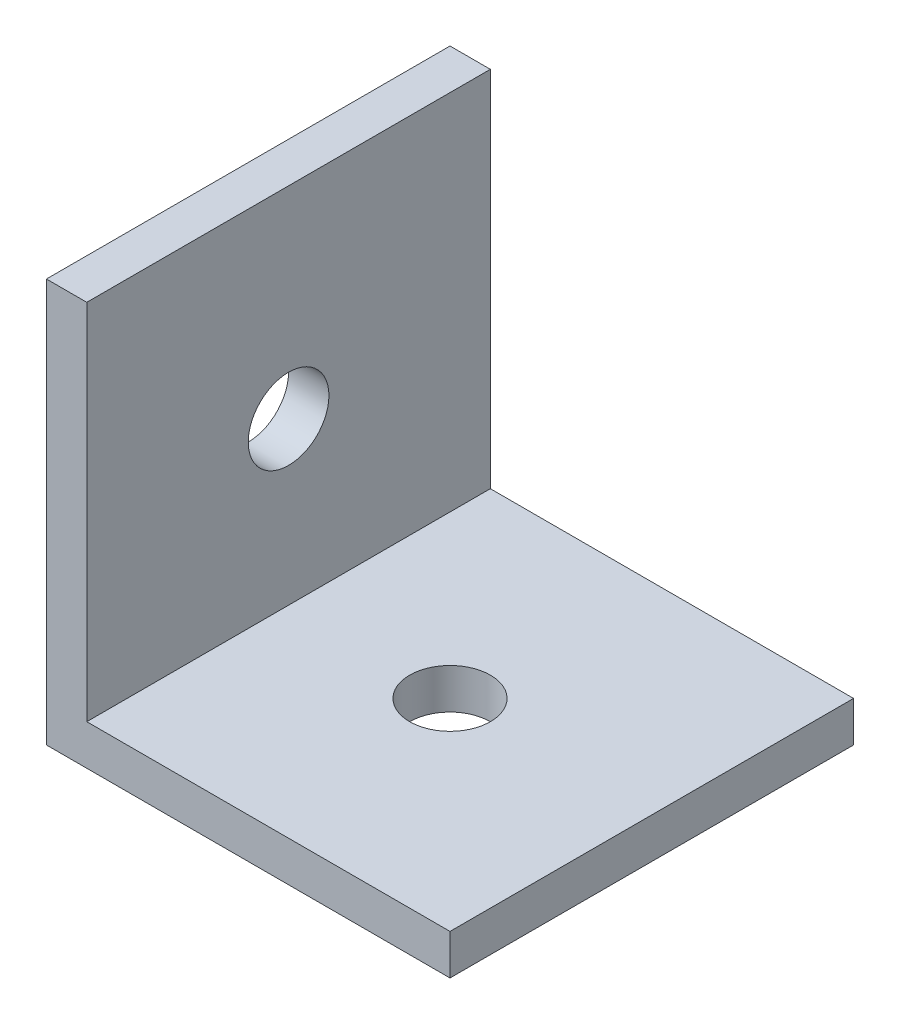
ISO-10303-21;
HEADER;
FILE_DESCRIPTION(('STEP AP214'),'2;1');
FILE_NAME('part.step','',(''),(''),'','','');
FILE_SCHEMA(('AUTOMOTIVE_DESIGN { 1 0 10303 214 1 1 1 1 }'));
ENDSEC;
DATA;
#1=APPLICATION_CONTEXT('core data for automotive mechanical design processes');
#2=APPLICATION_PROTOCOL_DEFINITION('international standard','automotive_design',2000,#1);
#3=PRODUCT_CONTEXT('',#1,'mechanical');
#4=PRODUCT('Part','Part','',(#3));
#5=PRODUCT_RELATED_PRODUCT_CATEGORY('part','',(#4));
#6=PRODUCT_DEFINITION_FORMATION('','',#4);
#7=PRODUCT_DEFINITION_CONTEXT('part definition',#1,'design');
#8=PRODUCT_DEFINITION('design','',#6,#7);
#9=PRODUCT_DEFINITION_SHAPE('','',#8);
#10=(LENGTH_UNIT() NAMED_UNIT(*) SI_UNIT(.MILLI.,.METRE.));
#11=(NAMED_UNIT(*) PLANE_ANGLE_UNIT() SI_UNIT($,.RADIAN.));
#12=(NAMED_UNIT(*) SI_UNIT($,.STERADIAN.) SOLID_ANGLE_UNIT());
#13=UNCERTAINTY_MEASURE_WITH_UNIT(LENGTH_MEASURE(1.E-05),#10,'distance_accuracy_value','');
#14=(GEOMETRIC_REPRESENTATION_CONTEXT(3) GLOBAL_UNCERTAINTY_ASSIGNED_CONTEXT((#13)) GLOBAL_UNIT_ASSIGNED_CONTEXT((#10,
#11,#12)) REPRESENTATION_CONTEXT('',''));
#15=CARTESIAN_POINT('',(0.,0.,0.));
#16=DIRECTION('',(0.,0.,1.));
#17=DIRECTION('',(1.,0.,0.));
#18=AXIS2_PLACEMENT_3D('',#15,#16,#17);
#19=CARTESIAN_POINT('',(-25.9312653272042,3.86410526315789,15.));
#20=DIRECTION('',(0.,-1.,0.));
#21=DIRECTION('',(0.,0.,-1.));
#22=AXIS2_PLACEMENT_3D('',#19,#20,#21);
#23=PLANE('',#22);
#24=DIRECTION('',(-1.,0.,0.));
#25=VECTOR('',#24,1.);
#26=CARTESIAN_POINT('',(-25.9312653272042,3.86410526315789,0.));
#27=LINE('',#26,#25);
#28=CARTESIAN_POINT('',(-25.9312653272042,3.86410526315789,0.));
#29=VERTEX_POINT('',#28);
#30=CARTESIAN_POINT('',(-27.4312653272042,3.86410526315789,0.));
#31=VERTEX_POINT('',#30);
#32=EDGE_CURVE('E115',#29,#31,#27,.T.);
#33=ORIENTED_EDGE('',*,*,#32,.T.);
#34=DIRECTION('',(0.,0.,-1.));
#35=VECTOR('',#34,1.);
#36=CARTESIAN_POINT('',(-27.4312653272042,3.86410526315789,15.));
#37=LINE('',#36,#35);
#38=CARTESIAN_POINT('',(-27.4312653272042,3.86410526315789,15.));
#39=VERTEX_POINT('',#38);
#40=EDGE_CURVE('E11',#39,#31,#37,.T.);
#41=ORIENTED_EDGE('',*,*,#40,.F.);
#42=DIRECTION('',(-1.,0.,0.));
#43=VECTOR('',#42,1.);
#44=CARTESIAN_POINT('',(-25.9312653272042,3.86410526315789,15.));
#45=LINE('',#44,#43);
#46=CARTESIAN_POINT('',(-25.9312653272042,3.86410526315789,15.));
#47=VERTEX_POINT('',#46);
#48=EDGE_CURVE('E126',#47,#39,#45,.T.);
#49=ORIENTED_EDGE('',*,*,#48,.F.);
#50=DIRECTION('',(0.,0.,-1.));
#51=VECTOR('',#50,1.);
#52=CARTESIAN_POINT('',(-25.9312653272042,3.86410526315789,15.));
#53=LINE('',#52,#51);
#54=EDGE_CURVE('E111',#47,#29,#53,.T.);
#55=ORIENTED_EDGE('',*,*,#54,.T.);
#56=EDGE_LOOP('',(#33,#41,#49,#55));
#57=FACE_BOUND('',#56,.T.);
#58=ADVANCED_FACE('F31',(#57),#23,.F.);
#59=CARTESIAN_POINT('',(-27.4312653272042,3.86410526315789,15.));
#60=DIRECTION('',(1.,0.,0.));
#61=DIRECTION('',(0.,0.,-1.));
#62=AXIS2_PLACEMENT_3D('',#59,#60,#61);
#63=PLANE('',#62);
#64=CARTESIAN_POINT('',(-27.4312653272042,-3.63589473684211,7.5));
#65=DIRECTION('',(1.,0.,0.));
#66=DIRECTION('',(0.,0.,-1.));
#67=AXIS2_PLACEMENT_3D('',#64,#65,#66);
#68=CIRCLE('',#67,1.5);
#69=CARTESIAN_POINT('',(-27.4312653272042,-3.63589473684211,6.));
#70=VERTEX_POINT('',#69);
#71=EDGE_CURVE('E119',#70,#70,#68,.T.);
#72=ORIENTED_EDGE('',*,*,#71,.T.);
#73=EDGE_LOOP('',(#72));
#74=FACE_BOUND('',#73,.T.);
#75=DIRECTION('',(0.,-1.,0.));
#76=VECTOR('',#75,1.);
#77=CARTESIAN_POINT('',(-27.4312653272042,3.86410526315789,0.));
#78=LINE('',#77,#76);
#79=CARTESIAN_POINT('',(-27.4312653272042,-11.1358947368421,0.));
#80=VERTEX_POINT('',#79);
#81=EDGE_CURVE('E118',#31,#80,#78,.T.);
#82=ORIENTED_EDGE('',*,*,#81,.T.);
#83=DIRECTION('',(0.,0.,-1.));
#84=VECTOR('',#83,1.);
#85=CARTESIAN_POINT('',(-27.4312653272042,-11.1358947368421,15.));
#86=LINE('',#85,#84);
#87=CARTESIAN_POINT('',(-27.4312653272042,-11.1358947368421,15.));
#88=VERTEX_POINT('',#87);
#89=EDGE_CURVE('E39',#88,#80,#86,.T.);
#90=ORIENTED_EDGE('',*,*,#89,.F.);
#91=DIRECTION('',(0.,-1.,0.));
#92=VECTOR('',#91,1.);
#93=CARTESIAN_POINT('',(-27.4312653272042,3.86410526315789,15.));
#94=LINE('',#93,#92);
#95=EDGE_CURVE('E84',#39,#88,#94,.T.);
#96=ORIENTED_EDGE('',*,*,#95,.F.);
#97=ORIENTED_EDGE('',*,*,#40,.T.);
#98=EDGE_LOOP('',(#82,#90,#96,#97));
#99=FACE_BOUND('',#98,.T.);
#100=ADVANCED_FACE('F153',(#74,#99),#63,.F.);
#101=CARTESIAN_POINT('',(-27.4312653272042,-11.1358947368421,15.));
#102=DIRECTION('',(0.,1.,0.));
#103=DIRECTION('',(0.,0.,1.));
#104=AXIS2_PLACEMENT_3D('',#101,#102,#103);
#105=PLANE('',#104);
#106=CARTESIAN_POINT('',(-19.9312653272042,-11.1358947368421,7.5));
#107=DIRECTION('',(0.,1.,0.));
#108=DIRECTION('',(0.,0.,1.));
#109=AXIS2_PLACEMENT_3D('',#106,#107,#108);
#110=CIRCLE('',#109,1.5);
#111=CARTESIAN_POINT('',(-19.9312653272042,-11.1358947368421,9.));
#112=VERTEX_POINT('',#111);
#113=EDGE_CURVE('E234',#112,#112,#110,.T.);
#114=ORIENTED_EDGE('',*,*,#113,.T.);
#115=EDGE_LOOP('',(#114));
#116=FACE_BOUND('',#115,.T.);
#117=DIRECTION('',(1.,0.,0.));
#118=VECTOR('',#117,1.);
#119=CARTESIAN_POINT('',(-27.4312653272042,-11.1358947368421,0.));
#120=LINE('',#119,#118);
#121=CARTESIAN_POINT('',(-12.4312653272042,-11.1358947368421,0.));
#122=VERTEX_POINT('',#121);
#123=EDGE_CURVE('E121',#80,#122,#120,.T.);
#124=ORIENTED_EDGE('',*,*,#123,.T.);
#125=DIRECTION('',(0.,0.,-1.));
#126=VECTOR('',#125,1.);
#127=CARTESIAN_POINT('',(-12.4312653272042,-11.1358947368421,15.));
#128=LINE('',#127,#126);
#129=CARTESIAN_POINT('',(-12.4312653272042,-11.1358947368421,15.));
#130=VERTEX_POINT('',#129);
#131=EDGE_CURVE('E106',#130,#122,#128,.T.);
#132=ORIENTED_EDGE('',*,*,#131,.F.);
#133=DIRECTION('',(1.,0.,0.));
#134=VECTOR('',#133,1.);
#135=CARTESIAN_POINT('',(-27.4312653272042,-11.1358947368421,15.));
#136=LINE('',#135,#134);
#137=EDGE_CURVE('E97',#88,#130,#136,.T.);
#138=ORIENTED_EDGE('',*,*,#137,.F.);
#139=ORIENTED_EDGE('',*,*,#89,.T.);
#140=EDGE_LOOP('',(#124,#132,#138,#139));
#141=FACE_BOUND('',#140,.T.);
#142=ADVANCED_FACE('F132',(#116,#141),#105,.F.);
#143=CARTESIAN_POINT('',(-12.4312653272042,-11.1358947368421,15.));
#144=DIRECTION('',(-1.,0.,0.));
#145=DIRECTION('',(0.,0.,1.));
#146=AXIS2_PLACEMENT_3D('',#143,#144,#145);
#147=PLANE('',#146);
#148=DIRECTION('',(0.,1.,0.));
#149=VECTOR('',#148,1.);
#150=CARTESIAN_POINT('',(-12.4312653272042,-11.1358947368421,0.));
#151=LINE('',#150,#149);
#152=CARTESIAN_POINT('',(-12.4312653272042,-9.63589473684211,0.));
#153=VERTEX_POINT('',#152);
#154=EDGE_CURVE('E105',#122,#153,#151,.T.);
#155=ORIENTED_EDGE('',*,*,#154,.T.);
#156=DIRECTION('',(0.,0.,-1.));
#157=VECTOR('',#156,1.);
#158=CARTESIAN_POINT('',(-12.4312653272042,-9.63589473684211,15.));
#159=LINE('',#158,#157);
#160=CARTESIAN_POINT('',(-12.4312653272042,-9.63589473684211,15.));
#161=VERTEX_POINT('',#160);
#162=EDGE_CURVE('E102',#161,#153,#159,.T.);
#163=ORIENTED_EDGE('',*,*,#162,.F.);
#164=DIRECTION('',(0.,1.,0.));
#165=VECTOR('',#164,1.);
#166=CARTESIAN_POINT('',(-12.4312653272042,-11.1358947368421,15.));
#167=LINE('',#166,#165);
#168=EDGE_CURVE('E91',#130,#161,#167,.T.);
#169=ORIENTED_EDGE('',*,*,#168,.F.);
#170=ORIENTED_EDGE('',*,*,#131,.T.);
#171=EDGE_LOOP('',(#155,#163,#169,#170));
#172=FACE_BOUND('',#171,.T.);
#173=ADVANCED_FACE('F103',(#172),#147,.F.);
#174=CARTESIAN_POINT('',(-12.4312653272042,-9.63589473684211,15.));
#175=DIRECTION('',(0.,-1.,0.));
#176=DIRECTION('',(1.,0.,0.));
#177=AXIS2_PLACEMENT_3D('',#174,#175,#176);
#178=PLANE('',#177);
#179=CARTESIAN_POINT('',(-19.9312653272042,-9.63589473684211,7.5));
#180=DIRECTION('',(0.,1.,0.));
#181=DIRECTION('',(-1.,0.,0.));
#182=AXIS2_PLACEMENT_3D('',#179,#180,#181);
#183=CIRCLE('',#182,1.5);
#184=CARTESIAN_POINT('',(-21.4312653272042,-9.63589473684211,7.5));
#185=VERTEX_POINT('',#184);
#186=EDGE_CURVE('E241',#185,#185,#183,.T.);
#187=ORIENTED_EDGE('',*,*,#186,.F.);
#188=EDGE_LOOP('',(#187));
#189=FACE_BOUND('',#188,.T.);
#190=DIRECTION('',(-1.,0.,0.));
#191=VECTOR('',#190,1.);
#192=CARTESIAN_POINT('',(-12.4312653272042,-9.63589473684211,0.));
#193=LINE('',#192,#191);
#194=CARTESIAN_POINT('',(-25.9312653272042,-9.63589473684212,0.));
#195=VERTEX_POINT('',#194);
#196=EDGE_CURVE('E70',#153,#195,#193,.T.);
#197=ORIENTED_EDGE('',*,*,#196,.T.);
#198=DIRECTION('',(0.,0.,-1.));
#199=VECTOR('',#198,1.);
#200=CARTESIAN_POINT('',(-25.9312653272042,-9.63589473684212,15.));
#201=LINE('',#200,#199);
#202=CARTESIAN_POINT('',(-25.9312653272042,-9.63589473684212,15.));
#203=VERTEX_POINT('',#202);
#204=EDGE_CURVE('E107',#203,#195,#201,.T.);
#205=ORIENTED_EDGE('',*,*,#204,.F.);
#206=DIRECTION('',(-1.,0.,0.));
#207=VECTOR('',#206,1.);
#208=CARTESIAN_POINT('',(-12.4312653272042,-9.63589473684211,15.));
#209=LINE('',#208,#207);
#210=EDGE_CURVE('E95',#161,#203,#209,.T.);
#211=ORIENTED_EDGE('',*,*,#210,.F.);
#212=ORIENTED_EDGE('',*,*,#162,.T.);
#213=EDGE_LOOP('',(#197,#205,#211,#212));
#214=FACE_BOUND('',#213,.T.);
#215=ADVANCED_FACE('F109',(#189,#214),#178,.F.);
#216=CARTESIAN_POINT('',(-25.9312653272042,-9.63589473684212,15.));
#217=DIRECTION('',(-1.,0.,0.));
#218=DIRECTION('',(0.,0.,1.));
#219=AXIS2_PLACEMENT_3D('',#216,#217,#218);
#220=PLANE('',#219);
#221=CARTESIAN_POINT('',(-25.9312653272042,-3.63589473684211,7.5));
#222=DIRECTION('',(1.,0.,0.));
#223=DIRECTION('',(0.,0.,-1.));
#224=AXIS2_PLACEMENT_3D('',#221,#222,#223);
#225=CIRCLE('',#224,1.5);
#226=CARTESIAN_POINT('',(-25.9312653272042,-3.63589473684211,6.));
#227=VERTEX_POINT('',#226);
#228=EDGE_CURVE('E231',#227,#227,#225,.T.);
#229=ORIENTED_EDGE('',*,*,#228,.F.);
#230=EDGE_LOOP('',(#229));
#231=FACE_BOUND('',#230,.T.);
#232=DIRECTION('',(0.,1.,0.));
#233=VECTOR('',#232,1.);
#234=CARTESIAN_POINT('',(-25.9312653272042,-9.63589473684212,0.));
#235=LINE('',#234,#233);
#236=EDGE_CURVE('E76',#195,#29,#235,.T.);
#237=ORIENTED_EDGE('',*,*,#236,.T.);
#238=ORIENTED_EDGE('',*,*,#54,.F.);
#239=DIRECTION('',(0.,1.,0.));
#240=VECTOR('',#239,1.);
#241=CARTESIAN_POINT('',(-25.9312653272042,-9.63589473684212,15.));
#242=LINE('',#241,#240);
#243=EDGE_CURVE('E47',#203,#47,#242,.T.);
#244=ORIENTED_EDGE('',*,*,#243,.F.);
#245=ORIENTED_EDGE('',*,*,#204,.T.);
#246=EDGE_LOOP('',(#237,#238,#244,#245));
#247=FACE_BOUND('',#246,.T.);
#248=ADVANCED_FACE('F139',(#231,#247),#220,.F.);
#249=CARTESIAN_POINT('',(-27.4312653272042,3.86410526315789,15.));
#250=DIRECTION('',(0.,0.,1.));
#251=DIRECTION('',(1.,0.,0.));
#252=AXIS2_PLACEMENT_3D('',#249,#250,#251);
#253=PLANE('',#252);
#254=ORIENTED_EDGE('',*,*,#48,.T.);
#255=ORIENTED_EDGE('',*,*,#95,.T.);
#256=ORIENTED_EDGE('',*,*,#137,.T.);
#257=ORIENTED_EDGE('',*,*,#168,.T.);
#258=ORIENTED_EDGE('',*,*,#210,.T.);
#259=ORIENTED_EDGE('',*,*,#243,.T.);
#260=EDGE_LOOP('',(#254,#255,#256,#257,#258,#259));
#261=FACE_BOUND('',#260,.T.);
#262=ADVANCED_FACE('F93',(#261),#253,.T.);
#263=CARTESIAN_POINT('',(-27.4312653272042,3.86410526315789,0.));
#264=DIRECTION('',(0.,0.,1.));
#265=DIRECTION('',(1.,0.,0.));
#266=AXIS2_PLACEMENT_3D('',#263,#264,#265);
#267=PLANE('',#266);
#268=ORIENTED_EDGE('',*,*,#32,.F.);
#269=ORIENTED_EDGE('',*,*,#236,.F.);
#270=ORIENTED_EDGE('',*,*,#196,.F.);
#271=ORIENTED_EDGE('',*,*,#154,.F.);
#272=ORIENTED_EDGE('',*,*,#123,.F.);
#273=ORIENTED_EDGE('',*,*,#81,.F.);
#274=EDGE_LOOP('',(#268,#269,#270,#271,#272,#273));
#275=FACE_BOUND('',#274,.T.);
#276=ADVANCED_FACE('F135',(#275),#267,.F.);
#277=CARTESIAN_POINT('',(-40.9312653272042,-3.63589473684211,7.5));
#278=DIRECTION('',(1.,0.,0.));
#279=DIRECTION('',(0.,0.,-1.));
#280=AXIS2_PLACEMENT_3D('',#277,#278,#279);
#281=CYLINDRICAL_SURFACE('',#280,1.5);
#282=ORIENTED_EDGE('',*,*,#228,.T.);
#283=EDGE_LOOP('',(#282));
#284=FACE_BOUND('',#283,.T.);
#285=ORIENTED_EDGE('',*,*,#71,.F.);
#286=EDGE_LOOP('',(#285));
#287=FACE_BOUND('',#286,.T.);
#288=ADVANCED_FACE('F188',(#284,#287),#281,.F.);
#289=CARTESIAN_POINT('',(-19.9312653272042,-24.6358947368421,7.5));
#290=DIRECTION('',(0.,1.,0.));
#291=DIRECTION('',(-1.,0.,0.));
#292=AXIS2_PLACEMENT_3D('',#289,#290,#291);
#293=CYLINDRICAL_SURFACE('',#292,1.5);
#294=ORIENTED_EDGE('',*,*,#186,.T.);
#295=EDGE_LOOP('',(#294));
#296=FACE_BOUND('',#295,.T.);
#297=ORIENTED_EDGE('',*,*,#113,.F.);
#298=EDGE_LOOP('',(#297));
#299=FACE_BOUND('',#298,.T.);
#300=ADVANCED_FACE('F184',(#296,#299),#293,.F.);
#301=CLOSED_SHELL('',(#58,#100,#142,#173,#215,#248,#262,#276,#288,#300));
#302=MANIFOLD_SOLID_BREP('B2',#301);
#303=ADVANCED_BREP_SHAPE_REPRESENTATION('',(#18,#302),#14);
#304=SHAPE_DEFINITION_REPRESENTATION(#9,#303);
ENDSEC;
END-ISO-10303-21;
